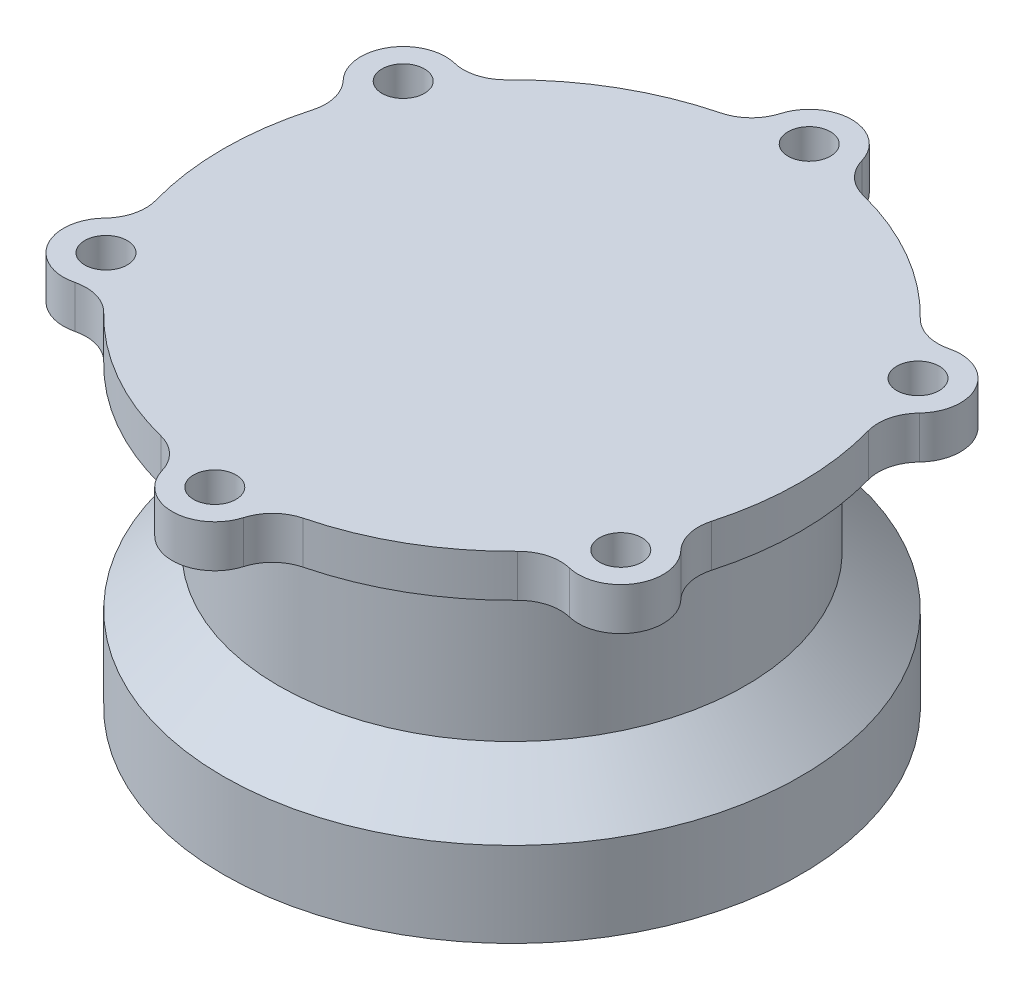
ISO-10303-21;
HEADER;
FILE_DESCRIPTION(('STEP AP214'),'2;1');
FILE_NAME('part.step','',(''),(''),'','','');
FILE_SCHEMA(('AUTOMOTIVE_DESIGN { 1 0 10303 214 1 1 1 1 }'));
ENDSEC;
DATA;
#1=APPLICATION_CONTEXT('core data for automotive mechanical design processes');
#2=APPLICATION_PROTOCOL_DEFINITION('international standard','automotive_design',2000,#1);
#3=PRODUCT_CONTEXT('',#1,'mechanical');
#4=PRODUCT('Part','Part','',(#3));
#5=PRODUCT_RELATED_PRODUCT_CATEGORY('part','',(#4));
#6=PRODUCT_DEFINITION_FORMATION('','',#4);
#7=PRODUCT_DEFINITION_CONTEXT('part definition',#1,'design');
#8=PRODUCT_DEFINITION('design','',#6,#7);
#9=PRODUCT_DEFINITION_SHAPE('','',#8);
#10=(LENGTH_UNIT() NAMED_UNIT(*) SI_UNIT(.MILLI.,.METRE.));
#11=(NAMED_UNIT(*) PLANE_ANGLE_UNIT() SI_UNIT($,.RADIAN.));
#12=(NAMED_UNIT(*) SI_UNIT($,.STERADIAN.) SOLID_ANGLE_UNIT());
#13=UNCERTAINTY_MEASURE_WITH_UNIT(LENGTH_MEASURE(1.E-05),#10,'distance_accuracy_value','');
#14=(GEOMETRIC_REPRESENTATION_CONTEXT(3) GLOBAL_UNCERTAINTY_ASSIGNED_CONTEXT((#13)) GLOBAL_UNIT_ASSIGNED_CONTEXT((#10,
#11,#12)) REPRESENTATION_CONTEXT('',''));
#15=CARTESIAN_POINT('',(0.,0.,0.));
#16=DIRECTION('',(0.,0.,1.));
#17=DIRECTION('',(1.,0.,0.));
#18=AXIS2_PLACEMENT_3D('',#15,#16,#17);
#19=CARTESIAN_POINT('',(0.,0.,0.));
#20=DIRECTION('',(0.,-1.,0.));
#21=DIRECTION('',(0.,0.,-1.));
#22=AXIS2_PLACEMENT_3D('',#19,#20,#21);
#23=PLANE('',#22);
#24=CARTESIAN_POINT('',(0.,0.,0.));
#25=DIRECTION('',(0.,1.,0.));
#26=DIRECTION('',(0.,0.,1.));
#27=AXIS2_PLACEMENT_3D('',#24,#25,#26);
#28=CIRCLE('',#27,34.);
#29=CARTESIAN_POINT('',(0.,0.,34.));
#30=VERTEX_POINT('',#29);
#31=EDGE_CURVE('E299',#30,#30,#28,.T.);
#32=ORIENTED_EDGE('',*,*,#31,.F.);
#33=EDGE_LOOP('',(#32));
#34=FACE_BOUND('',#33,.T.);
#35=ADVANCED_FACE('F33',(#34),#23,.T.);
#36=CARTESIAN_POINT('',(0.,67.2765631047677,0.));
#37=DIRECTION('',(0.,1.,0.));
#38=DIRECTION('',(0.,0.,1.));
#39=AXIS2_PLACEMENT_3D('',#36,#37,#38);
#40=CYLINDRICAL_SURFACE('',#39,34.);
#41=ORIENTED_EDGE('',*,*,#31,.T.);
#42=EDGE_LOOP('',(#41));
#43=FACE_BOUND('',#42,.T.);
#44=CARTESIAN_POINT('',(0.,9.99999999999999,0.));
#45=DIRECTION('',(0.,1.,0.));
#46=DIRECTION('',(0.,0.,1.));
#47=AXIS2_PLACEMENT_3D('',#44,#45,#46);
#48=CIRCLE('',#47,34.);
#49=CARTESIAN_POINT('',(0.,9.99999999999999,34.));
#50=VERTEX_POINT('',#49);
#51=EDGE_CURVE('E296',#50,#50,#48,.T.);
#52=ORIENTED_EDGE('',*,*,#51,.F.);
#53=EDGE_LOOP('',(#52));
#54=FACE_BOUND('',#53,.T.);
#55=ADVANCED_FACE('F467',(#43,#54),#40,.T.);
#56=CARTESIAN_POINT('',(0.,16.,0.));
#57=DIRECTION('',(0.,-1.,0.));
#58=DIRECTION('',(0.,0.,-1.));
#59=AXIS2_PLACEMENT_3D('',#56,#57,#58);
#60=CONICAL_SURFACE('',#59,27.5,0.825376850520739);
#61=ORIENTED_EDGE('',*,*,#51,.T.);
#62=EDGE_LOOP('',(#61));
#63=FACE_BOUND('',#62,.T.);
#64=CARTESIAN_POINT('',(0.,16.,0.));
#65=DIRECTION('',(0.,1.,0.));
#66=DIRECTION('',(0.,0.,1.));
#67=AXIS2_PLACEMENT_3D('',#64,#65,#66);
#68=CIRCLE('',#67,27.5);
#69=CARTESIAN_POINT('',(0.,16.,27.5));
#70=VERTEX_POINT('',#69);
#71=EDGE_CURVE('E292',#70,#70,#68,.T.);
#72=ORIENTED_EDGE('',*,*,#71,.F.);
#73=EDGE_LOOP('',(#72));
#74=FACE_BOUND('',#73,.T.);
#75=ADVANCED_FACE('F473',(#63,#74),#60,.T.);
#76=CARTESIAN_POINT('',(0.,67.2765631047677,0.));
#77=DIRECTION('',(0.,1.,0.));
#78=DIRECTION('',(0.,0.,1.));
#79=AXIS2_PLACEMENT_3D('',#76,#77,#78);
#80=CYLINDRICAL_SURFACE('',#79,27.5);
#81=ORIENTED_EDGE('',*,*,#71,.T.);
#82=EDGE_LOOP('',(#81));
#83=FACE_BOUND('',#82,.T.);
#84=CARTESIAN_POINT('',(0.,35.,0.));
#85=DIRECTION('',(0.,1.,0.));
#86=DIRECTION('',(0.,0.,1.));
#87=AXIS2_PLACEMENT_3D('',#84,#85,#86);
#88=CIRCLE('',#87,27.5);
#89=CARTESIAN_POINT('',(0.,35.,27.5));
#90=VERTEX_POINT('',#89);
#91=EDGE_CURVE('E289',#90,#90,#88,.T.);
#92=ORIENTED_EDGE('',*,*,#91,.F.);
#93=EDGE_LOOP('',(#92));
#94=FACE_BOUND('',#93,.T.);
#95=ADVANCED_FACE('F571',(#83,#94),#80,.T.);
#96=CARTESIAN_POINT('',(0.,40.,35.));
#97=DIRECTION('',(0.,-1.,0.));
#98=DIRECTION('',(0.,0.,-1.));
#99=AXIS2_PLACEMENT_3D('',#96,#97,#98);
#100=CYLINDRICAL_SURFACE('',#99,5.);
#101=CARTESIAN_POINT('',(0.,40.,35.));
#102=DIRECTION('',(0.,1.,0.));
#103=DIRECTION('',(0.,0.,1.));
#104=AXIS2_PLACEMENT_3D('',#101,#102,#103);
#105=CIRCLE('',#104,5.);
#106=CARTESIAN_POINT('',(-4.8,40.,36.4));
#107=VERTEX_POINT('',#106);
#108=CARTESIAN_POINT('',(4.80000000000001,40.,36.4));
#109=VERTEX_POINT('',#108);
#110=EDGE_CURVE('E288',#107,#109,#105,.T.);
#111=ORIENTED_EDGE('',*,*,#110,.F.);
#112=DIRECTION('',(0.,-1.,0.));
#113=VECTOR('',#112,1.);
#114=CARTESIAN_POINT('',(-4.8,40.,36.4));
#115=LINE('',#114,#113);
#116=CARTESIAN_POINT('',(-4.8,35.,36.4));
#117=VERTEX_POINT('',#116);
#118=EDGE_CURVE('E206',#107,#117,#115,.T.);
#119=ORIENTED_EDGE('',*,*,#118,.T.);
#120=CARTESIAN_POINT('',(0.,35.,35.));
#121=DIRECTION('',(0.,1.,0.));
#122=DIRECTION('',(0.,0.,1.));
#123=AXIS2_PLACEMENT_3D('',#120,#121,#122);
#124=CIRCLE('',#123,5.);
#125=CARTESIAN_POINT('',(4.80000000000001,35.,36.4));
#126=VERTEX_POINT('',#125);
#127=EDGE_CURVE('E235',#117,#126,#124,.T.);
#128=ORIENTED_EDGE('',*,*,#127,.T.);
#129=DIRECTION('',(0.,-1.,0.));
#130=VECTOR('',#129,1.);
#131=CARTESIAN_POINT('',(4.80000000000001,40.,36.4));
#132=LINE('',#131,#130);
#133=EDGE_CURVE('E48',#126,#109,#132,.F.);
#134=ORIENTED_EDGE('',*,*,#133,.T.);
#135=EDGE_LOOP('',(#111,#119,#128,#134));
#136=FACE_BOUND('',#135,.T.);
#137=ADVANCED_FACE('F390',(#136),#100,.T.);
#138=CARTESIAN_POINT('',(0.,40.,0.));
#139=DIRECTION('',(0.,-1.,0.));
#140=DIRECTION('',(0.,0.,-1.));
#141=AXIS2_PLACEMENT_3D('',#138,#139,#140);
#142=CYLINDRICAL_SURFACE('',#141,34.);
#143=CARTESIAN_POINT('',(0.,35.,0.));
#144=DIRECTION('',(0.,1.,0.));
#145=DIRECTION('',(0.,0.,1.));
#146=AXIS2_PLACEMENT_3D('',#143,#144,#145);
#147=CIRCLE('',#146,34.);
#148=CARTESIAN_POINT('',(8.36923076923078,35.,32.9538461538462));
#149=VERTEX_POINT('',#148);
#150=CARTESIAN_POINT('',(24.3542525370195,35.,23.7248895332113));
#151=VERTEX_POINT('',#150);
#152=EDGE_CURVE('E225',#149,#151,#147,.T.);
#153=ORIENTED_EDGE('',*,*,#152,.T.);
#154=DIRECTION('',(0.,-1.,0.));
#155=VECTOR('',#154,1.);
#156=CARTESIAN_POINT('',(24.3542525370195,40.,23.7248895332113));
#157=LINE('',#156,#155);
#158=CARTESIAN_POINT('',(24.3542525370195,40.,23.7248895332113));
#159=VERTEX_POINT('',#158);
#160=EDGE_CURVE('E344',#151,#159,#157,.F.);
#161=ORIENTED_EDGE('',*,*,#160,.T.);
#162=CARTESIAN_POINT('',(0.,40.,0.));
#163=DIRECTION('',(0.,1.,0.));
#164=DIRECTION('',(0.,0.,1.));
#165=AXIS2_PLACEMENT_3D('',#162,#163,#164);
#166=CIRCLE('',#165,34.);
#167=CARTESIAN_POINT('',(8.36923076923078,40.,32.9538461538462));
#168=VERTEX_POINT('',#167);
#169=EDGE_CURVE('E397',#168,#159,#166,.T.);
#170=ORIENTED_EDGE('',*,*,#169,.F.);
#171=DIRECTION('',(0.,-1.,0.));
#172=VECTOR('',#171,1.);
#173=CARTESIAN_POINT('',(8.36923076923078,40.,32.9538461538462));
#174=LINE('',#173,#172);
#175=EDGE_CURVE('E341',#168,#149,#174,.T.);
#176=ORIENTED_EDGE('',*,*,#175,.T.);
#177=EDGE_LOOP('',(#153,#161,#170,#176));
#178=FACE_BOUND('',#177,.T.);
#179=ADVANCED_FACE('F400',(#178),#142,.T.);
#180=CARTESIAN_POINT('',(30.3108891324554,40.,17.5));
#181=DIRECTION('',(0.,-1.,0.));
#182=DIRECTION('',(0.,0.,-1.));
#183=AXIS2_PLACEMENT_3D('',#180,#181,#182);
#184=CYLINDRICAL_SURFACE('',#183,5.);
#185=CARTESIAN_POINT('',(30.3108891324554,40.,17.5));
#186=DIRECTION('',(0.,1.,0.));
#187=DIRECTION('',(0.,0.,1.));
#188=AXIS2_PLACEMENT_3D('',#185,#186,#187);
#189=CIRCLE('',#188,5.);
#190=CARTESIAN_POINT('',(29.1233246977536,40.,22.3569219381653));
#191=VERTEX_POINT('',#190);
#192=CARTESIAN_POINT('',(33.9233246977536,40.,14.0430780618347));
#193=VERTEX_POINT('',#192);
#194=EDGE_CURVE('E402',#191,#193,#189,.T.);
#195=ORIENTED_EDGE('',*,*,#194,.F.);
#196=DIRECTION('',(0.,-1.,0.));
#197=VECTOR('',#196,1.);
#198=CARTESIAN_POINT('',(29.1233246977536,40.,22.3569219381653));
#199=LINE('',#198,#197);
#200=CARTESIAN_POINT('',(29.1233246977536,35.,22.3569219381653));
#201=VERTEX_POINT('',#200);
#202=EDGE_CURVE('E339',#191,#201,#199,.T.);
#203=ORIENTED_EDGE('',*,*,#202,.T.);
#204=CARTESIAN_POINT('',(30.3108891324554,35.,17.5));
#205=DIRECTION('',(0.,1.,0.));
#206=DIRECTION('',(0.,0.,1.));
#207=AXIS2_PLACEMENT_3D('',#204,#205,#206);
#208=CIRCLE('',#207,5.);
#209=CARTESIAN_POINT('',(33.9233246977536,35.,14.0430780618347));
#210=VERTEX_POINT('',#209);
#211=EDGE_CURVE('E234',#201,#210,#208,.T.);
#212=ORIENTED_EDGE('',*,*,#211,.T.);
#213=DIRECTION('',(0.,-1.,0.));
#214=VECTOR('',#213,1.);
#215=CARTESIAN_POINT('',(33.9233246977536,40.,14.0430780618347));
#216=LINE('',#215,#214);
#217=EDGE_CURVE('E337',#210,#193,#216,.F.);
#218=ORIENTED_EDGE('',*,*,#217,.T.);
#219=EDGE_LOOP('',(#195,#203,#212,#218));
#220=FACE_BOUND('',#219,.T.);
#221=ADVANCED_FACE('F558',(#220),#184,.T.);
#222=CARTESIAN_POINT('',(32.7234833062503,35.,9.22895662063485));
#223=VERTEX_POINT('',#222);
#224=CARTESIAN_POINT('',(32.7234833062503,35.,-9.22895662063485));
#225=VERTEX_POINT('',#224);
#226=EDGE_CURVE('E236',#223,#225,#147,.T.);
#227=ORIENTED_EDGE('',*,*,#226,.T.);
#228=DIRECTION('',(0.,-1.,0.));
#229=VECTOR('',#228,1.);
#230=CARTESIAN_POINT('',(32.7234833062503,40.,-9.22895662063485));
#231=LINE('',#230,#229);
#232=CARTESIAN_POINT('',(32.7234833062503,40.,-9.22895662063485));
#233=VERTEX_POINT('',#232);
#234=EDGE_CURVE('E335',#225,#233,#231,.F.);
#235=ORIENTED_EDGE('',*,*,#234,.T.);
#236=CARTESIAN_POINT('',(32.7234833062503,40.,9.22895662063485));
#237=VERTEX_POINT('',#236);
#238=EDGE_CURVE('E404',#237,#233,#166,.T.);
#239=ORIENTED_EDGE('',*,*,#238,.F.);
#240=DIRECTION('',(0.,-1.,0.));
#241=VECTOR('',#240,1.);
#242=CARTESIAN_POINT('',(32.7234833062503,40.,9.22895662063485));
#243=LINE('',#242,#241);
#244=EDGE_CURVE('E333',#237,#223,#243,.T.);
#245=ORIENTED_EDGE('',*,*,#244,.T.);
#246=EDGE_LOOP('',(#227,#235,#239,#245));
#247=FACE_BOUND('',#246,.T.);
#248=ADVANCED_FACE('F527',(#247),#142,.T.);
#249=CARTESIAN_POINT('',(30.3108891324554,40.,-17.5));
#250=DIRECTION('',(0.,-1.,0.));
#251=DIRECTION('',(0.,0.,-1.));
#252=AXIS2_PLACEMENT_3D('',#249,#250,#251);
#253=CYLINDRICAL_SURFACE('',#252,5.);
#254=CARTESIAN_POINT('',(30.3108891324554,35.,-17.5));
#255=DIRECTION('',(0.,1.,0.));
#256=DIRECTION('',(0.,0.,1.));
#257=AXIS2_PLACEMENT_3D('',#254,#255,#256);
#258=CIRCLE('',#257,5.);
#259=CARTESIAN_POINT('',(33.9233246977536,35.,-14.0430780618347));
#260=VERTEX_POINT('',#259);
#261=CARTESIAN_POINT('',(29.1233246977536,35.,-22.3569219381653));
#262=VERTEX_POINT('',#261);
#263=EDGE_CURVE('E256',#260,#262,#258,.T.);
#264=ORIENTED_EDGE('',*,*,#263,.T.);
#265=DIRECTION('',(0.,-1.,0.));
#266=VECTOR('',#265,1.);
#267=CARTESIAN_POINT('',(29.1233246977536,40.,-22.3569219381653));
#268=LINE('',#267,#266);
#269=CARTESIAN_POINT('',(29.1233246977536,40.,-22.3569219381653));
#270=VERTEX_POINT('',#269);
#271=EDGE_CURVE('E331',#262,#270,#268,.F.);
#272=ORIENTED_EDGE('',*,*,#271,.T.);
#273=CARTESIAN_POINT('',(30.3108891324554,40.,-17.5));
#274=DIRECTION('',(0.,1.,0.));
#275=DIRECTION('',(0.,0.,1.));
#276=AXIS2_PLACEMENT_3D('',#273,#274,#275);
#277=CIRCLE('',#276,5.);
#278=CARTESIAN_POINT('',(33.9233246977536,40.,-14.0430780618347));
#279=VERTEX_POINT('',#278);
#280=EDGE_CURVE('E409',#279,#270,#277,.T.);
#281=ORIENTED_EDGE('',*,*,#280,.F.);
#282=DIRECTION('',(0.,-1.,0.));
#283=VECTOR('',#282,1.);
#284=CARTESIAN_POINT('',(33.9233246977536,40.,-14.0430780618347));
#285=LINE('',#284,#283);
#286=EDGE_CURVE('E328',#279,#260,#285,.T.);
#287=ORIENTED_EDGE('',*,*,#286,.T.);
#288=EDGE_LOOP('',(#264,#272,#281,#287));
#289=FACE_BOUND('',#288,.T.);
#290=ADVANCED_FACE('F530',(#289),#253,.T.);
#291=CARTESIAN_POINT('',(24.3542525370195,40.,-23.7248895332113));
#292=VERTEX_POINT('',#291);
#293=CARTESIAN_POINT('',(8.36923076923078,40.,-32.9538461538462));
#294=VERTEX_POINT('',#293);
#295=EDGE_CURVE('E410',#292,#294,#166,.T.);
#296=ORIENTED_EDGE('',*,*,#295,.F.);
#297=DIRECTION('',(0.,-1.,0.));
#298=VECTOR('',#297,1.);
#299=CARTESIAN_POINT('',(24.3542525370195,40.,-23.7248895332113));
#300=LINE('',#299,#298);
#301=CARTESIAN_POINT('',(24.3542525370195,35.,-23.7248895332113));
#302=VERTEX_POINT('',#301);
#303=EDGE_CURVE('E326',#292,#302,#300,.T.);
#304=ORIENTED_EDGE('',*,*,#303,.T.);
#305=CARTESIAN_POINT('',(8.36923076923078,35.,-32.9538461538462));
#306=VERTEX_POINT('',#305);
#307=EDGE_CURVE('E248',#302,#306,#147,.T.);
#308=ORIENTED_EDGE('',*,*,#307,.T.);
#309=DIRECTION('',(0.,-1.,0.));
#310=VECTOR('',#309,1.);
#311=CARTESIAN_POINT('',(8.36923076923078,40.,-32.9538461538462));
#312=LINE('',#311,#310);
#313=EDGE_CURVE('E324',#306,#294,#312,.F.);
#314=ORIENTED_EDGE('',*,*,#313,.T.);
#315=EDGE_LOOP('',(#296,#304,#308,#314));
#316=FACE_BOUND('',#315,.T.);
#317=ADVANCED_FACE('F534',(#316),#142,.T.);
#318=CARTESIAN_POINT('',(0.,40.,-35.));
#319=DIRECTION('',(0.,-1.,0.));
#320=DIRECTION('',(0.,0.,-1.));
#321=AXIS2_PLACEMENT_3D('',#318,#319,#320);
#322=CYLINDRICAL_SURFACE('',#321,5.);
#323=CARTESIAN_POINT('',(0.,35.,-35.));
#324=DIRECTION('',(0.,1.,0.));
#325=DIRECTION('',(0.,0.,1.));
#326=AXIS2_PLACEMENT_3D('',#323,#324,#325);
#327=CIRCLE('',#326,5.);
#328=CARTESIAN_POINT('',(4.8,35.,-36.4));
#329=VERTEX_POINT('',#328);
#330=CARTESIAN_POINT('',(-4.8,35.,-36.4));
#331=VERTEX_POINT('',#330);
#332=EDGE_CURVE('E247',#329,#331,#327,.T.);
#333=ORIENTED_EDGE('',*,*,#332,.T.);
#334=DIRECTION('',(0.,-1.,0.));
#335=VECTOR('',#334,1.);
#336=CARTESIAN_POINT('',(-4.8,40.,-36.4));
#337=LINE('',#336,#335);
#338=CARTESIAN_POINT('',(-4.8,40.,-36.4));
#339=VERTEX_POINT('',#338);
#340=EDGE_CURVE('E322',#331,#339,#337,.F.);
#341=ORIENTED_EDGE('',*,*,#340,.T.);
#342=CARTESIAN_POINT('',(0.,40.,-35.));
#343=DIRECTION('',(0.,1.,0.));
#344=DIRECTION('',(0.,0.,1.));
#345=AXIS2_PLACEMENT_3D('',#342,#343,#344);
#346=CIRCLE('',#345,5.);
#347=CARTESIAN_POINT('',(4.8,40.,-36.4));
#348=VERTEX_POINT('',#347);
#349=EDGE_CURVE('E427',#348,#339,#346,.T.);
#350=ORIENTED_EDGE('',*,*,#349,.F.);
#351=DIRECTION('',(0.,-1.,0.));
#352=VECTOR('',#351,1.);
#353=CARTESIAN_POINT('',(4.8,40.,-36.4));
#354=LINE('',#353,#352);
#355=EDGE_CURVE('E319',#348,#329,#354,.T.);
#356=ORIENTED_EDGE('',*,*,#355,.T.);
#357=EDGE_LOOP('',(#333,#341,#350,#356));
#358=FACE_BOUND('',#357,.T.);
#359=ADVANCED_FACE('F539',(#358),#322,.T.);
#360=CARTESIAN_POINT('',(-8.36923076923077,40.,-32.9538461538462));
#361=VERTEX_POINT('',#360);
#362=CARTESIAN_POINT('',(-24.3542525370195,40.,-23.7248895332113));
#363=VERTEX_POINT('',#362);
#364=EDGE_CURVE('E421',#361,#363,#166,.T.);
#365=ORIENTED_EDGE('',*,*,#364,.F.);
#366=DIRECTION('',(0.,-1.,0.));
#367=VECTOR('',#366,1.);
#368=CARTESIAN_POINT('',(-8.36923076923077,40.,-32.9538461538462));
#369=LINE('',#368,#367);
#370=CARTESIAN_POINT('',(-8.36923076923077,35.,-32.9538461538462));
#371=VERTEX_POINT('',#370);
#372=EDGE_CURVE('E317',#361,#371,#369,.T.);
#373=ORIENTED_EDGE('',*,*,#372,.T.);
#374=CARTESIAN_POINT('',(-24.3542525370195,35.,-23.7248895332113));
#375=VERTEX_POINT('',#374);
#376=EDGE_CURVE('E239',#371,#375,#147,.T.);
#377=ORIENTED_EDGE('',*,*,#376,.T.);
#378=DIRECTION('',(0.,-1.,0.));
#379=VECTOR('',#378,1.);
#380=CARTESIAN_POINT('',(-24.3542525370195,40.,-23.7248895332113));
#381=LINE('',#380,#379);
#382=EDGE_CURVE('E315',#375,#363,#381,.F.);
#383=ORIENTED_EDGE('',*,*,#382,.T.);
#384=EDGE_LOOP('',(#365,#373,#377,#383));
#385=FACE_BOUND('',#384,.T.);
#386=ADVANCED_FACE('F543',(#385),#142,.T.);
#387=CARTESIAN_POINT('',(-30.3108891324554,40.,-17.5));
#388=DIRECTION('',(0.,-1.,0.));
#389=DIRECTION('',(0.,0.,-1.));
#390=AXIS2_PLACEMENT_3D('',#387,#388,#389);
#391=CYLINDRICAL_SURFACE('',#390,5.);
#392=CARTESIAN_POINT('',(-30.3108891324554,35.,-17.5));
#393=DIRECTION('',(0.,1.,0.));
#394=DIRECTION('',(0.,0.,1.));
#395=AXIS2_PLACEMENT_3D('',#392,#393,#394);
#396=CIRCLE('',#395,5.);
#397=CARTESIAN_POINT('',(-29.1233246977536,35.,-22.3569219381653));
#398=VERTEX_POINT('',#397);
#399=CARTESIAN_POINT('',(-33.9233246977536,35.,-14.0430780618347));
#400=VERTEX_POINT('',#399);
#401=EDGE_CURVE('E238',#398,#400,#396,.T.);
#402=ORIENTED_EDGE('',*,*,#401,.T.);
#403=DIRECTION('',(0.,-1.,0.));
#404=VECTOR('',#403,1.);
#405=CARTESIAN_POINT('',(-33.9233246977536,40.,-14.0430780618347));
#406=LINE('',#405,#404);
#407=CARTESIAN_POINT('',(-33.9233246977536,40.,-14.0430780618347));
#408=VERTEX_POINT('',#407);
#409=EDGE_CURVE('E313',#400,#408,#406,.F.);
#410=ORIENTED_EDGE('',*,*,#409,.T.);
#411=CARTESIAN_POINT('',(-30.3108891324554,40.,-17.5));
#412=DIRECTION('',(0.,1.,0.));
#413=DIRECTION('',(0.,0.,1.));
#414=AXIS2_PLACEMENT_3D('',#411,#412,#413);
#415=CIRCLE('',#414,5.);
#416=CARTESIAN_POINT('',(-29.1233246977536,40.,-22.3569219381653));
#417=VERTEX_POINT('',#416);
#418=EDGE_CURVE('E420',#417,#408,#415,.T.);
#419=ORIENTED_EDGE('',*,*,#418,.F.);
#420=DIRECTION('',(0.,-1.,0.));
#421=VECTOR('',#420,1.);
#422=CARTESIAN_POINT('',(-29.1233246977536,40.,-22.3569219381653));
#423=LINE('',#422,#421);
#424=EDGE_CURVE('E310',#417,#398,#423,.T.);
#425=ORIENTED_EDGE('',*,*,#424,.T.);
#426=EDGE_LOOP('',(#402,#410,#419,#425));
#427=FACE_BOUND('',#426,.T.);
#428=ADVANCED_FACE('F548',(#427),#391,.T.);
#429=CARTESIAN_POINT('',(-32.7234833062503,40.,-9.22895662063484));
#430=VERTEX_POINT('',#429);
#431=CARTESIAN_POINT('',(-32.7234833062503,40.,9.22895662063486));
#432=VERTEX_POINT('',#431);
#433=EDGE_CURVE('E413',#430,#432,#166,.T.);
#434=ORIENTED_EDGE('',*,*,#433,.F.);
#435=DIRECTION('',(0.,-1.,0.));
#436=VECTOR('',#435,1.);
#437=CARTESIAN_POINT('',(-32.7234833062503,40.,-9.22895662063484));
#438=LINE('',#437,#436);
#439=CARTESIAN_POINT('',(-32.7234833062503,35.,-9.22895662063484));
#440=VERTEX_POINT('',#439);
#441=EDGE_CURVE('E308',#430,#440,#438,.T.);
#442=ORIENTED_EDGE('',*,*,#441,.T.);
#443=CARTESIAN_POINT('',(-32.7234833062503,35.,9.22895662063486));
#444=VERTEX_POINT('',#443);
#445=EDGE_CURVE('E226',#440,#444,#147,.T.);
#446=ORIENTED_EDGE('',*,*,#445,.T.);
#447=DIRECTION('',(0.,-1.,0.));
#448=VECTOR('',#447,1.);
#449=CARTESIAN_POINT('',(-32.7234833062503,40.,9.22895662063486));
#450=LINE('',#449,#448);
#451=EDGE_CURVE('E306',#444,#432,#450,.F.);
#452=ORIENTED_EDGE('',*,*,#451,.T.);
#453=EDGE_LOOP('',(#434,#442,#446,#452));
#454=FACE_BOUND('',#453,.T.);
#455=ADVANCED_FACE('F552',(#454),#142,.T.);
#456=CARTESIAN_POINT('',(-30.3108891324554,40.,17.5));
#457=DIRECTION('',(0.,-1.,0.));
#458=DIRECTION('',(0.,0.,-1.));
#459=AXIS2_PLACEMENT_3D('',#456,#457,#458);
#460=CYLINDRICAL_SURFACE('',#459,5.);
#461=CARTESIAN_POINT('',(-30.3108891324554,35.,17.5));
#462=DIRECTION('',(0.,1.,0.));
#463=DIRECTION('',(0.,0.,1.));
#464=AXIS2_PLACEMENT_3D('',#461,#462,#463);
#465=CIRCLE('',#464,5.);
#466=CARTESIAN_POINT('',(-33.9233246977536,35.,14.0430780618347));
#467=VERTEX_POINT('',#466);
#468=CARTESIAN_POINT('',(-29.1233246977536,35.,22.3569219381653));
#469=VERTEX_POINT('',#468);
#470=EDGE_CURVE('E223',#467,#469,#465,.T.);
#471=ORIENTED_EDGE('',*,*,#470,.T.);
#472=DIRECTION('',(0.,-1.,0.));
#473=VECTOR('',#472,1.);
#474=CARTESIAN_POINT('',(-29.1233246977536,40.,22.3569219381653));
#475=LINE('',#474,#473);
#476=CARTESIAN_POINT('',(-29.1233246977536,40.,22.3569219381653));
#477=VERTEX_POINT('',#476);
#478=EDGE_CURVE('E200',#469,#477,#475,.F.);
#479=ORIENTED_EDGE('',*,*,#478,.T.);
#480=CARTESIAN_POINT('',(-30.3108891324554,40.,17.5));
#481=DIRECTION('',(0.,1.,0.));
#482=DIRECTION('',(0.,0.,1.));
#483=AXIS2_PLACEMENT_3D('',#480,#481,#482);
#484=CIRCLE('',#483,5.);
#485=CARTESIAN_POINT('',(-33.9233246977536,40.,14.0430780618347));
#486=VERTEX_POINT('',#485);
#487=EDGE_CURVE('E412',#486,#477,#484,.T.);
#488=ORIENTED_EDGE('',*,*,#487,.F.);
#489=DIRECTION('',(0.,-1.,0.));
#490=VECTOR('',#489,1.);
#491=CARTESIAN_POINT('',(-33.9233246977536,40.,14.0430780618347));
#492=LINE('',#491,#490);
#493=EDGE_CURVE('E215',#486,#467,#492,.T.);
#494=ORIENTED_EDGE('',*,*,#493,.T.);
#495=EDGE_LOOP('',(#471,#479,#488,#494));
#496=FACE_BOUND('',#495,.T.);
#497=ADVANCED_FACE('F556',(#496),#460,.T.);
#498=CARTESIAN_POINT('',(-30.3108891324554,40.,17.5));
#499=DIRECTION('',(0.,-1.,0.));
#500=DIRECTION('',(0.,0.,-1.));
#501=AXIS2_PLACEMENT_3D('',#498,#499,#500);
#502=CYLINDRICAL_SURFACE('',#501,2.50000000000032);
#503=CARTESIAN_POINT('',(-30.3108891324554,40.,17.5));
#504=DIRECTION('',(0.,1.,0.));
#505=DIRECTION('',(0.,0.,1.));
#506=AXIS2_PLACEMENT_3D('',#503,#504,#505);
#507=CIRCLE('',#506,2.50000000000032);
#508=CARTESIAN_POINT('',(-30.3108891324554,40.,20.0000000000003));
#509=VERTEX_POINT('',#508);
#510=EDGE_CURVE('E448',#509,#509,#507,.T.);
#511=ORIENTED_EDGE('',*,*,#510,.T.);
#512=EDGE_LOOP('',(#511));
#513=FACE_BOUND('',#512,.T.);
#514=CARTESIAN_POINT('',(-30.3108891324554,35.,17.5));
#515=DIRECTION('',(0.,1.,0.));
#516=DIRECTION('',(0.,0.,1.));
#517=AXIS2_PLACEMENT_3D('',#514,#515,#516);
#518=CIRCLE('',#517,2.50000000000032);
#519=CARTESIAN_POINT('',(-30.3108891324554,35.,20.0000000000003));
#520=VERTEX_POINT('',#519);
#521=EDGE_CURVE('E282',#520,#520,#518,.T.);
#522=ORIENTED_EDGE('',*,*,#521,.F.);
#523=EDGE_LOOP('',(#522));
#524=FACE_BOUND('',#523,.T.);
#525=ADVANCED_FACE('F662',(#513,#524),#502,.F.);
#526=CARTESIAN_POINT('',(-30.3108891324554,40.,-17.5));
#527=DIRECTION('',(0.,-1.,0.));
#528=DIRECTION('',(0.,0.,-1.));
#529=AXIS2_PLACEMENT_3D('',#526,#527,#528);
#530=CYLINDRICAL_SURFACE('',#529,2.50000000000041);
#531=CARTESIAN_POINT('',(-30.3108891324554,40.,-17.5));
#532=DIRECTION('',(0.,1.,0.));
#533=DIRECTION('',(0.,0.,1.));
#534=AXIS2_PLACEMENT_3D('',#531,#532,#533);
#535=CIRCLE('',#534,2.50000000000041);
#536=CARTESIAN_POINT('',(-30.3108891324554,40.,-14.9999999999996));
#537=VERTEX_POINT('',#536);
#538=EDGE_CURVE('E445',#537,#537,#535,.T.);
#539=ORIENTED_EDGE('',*,*,#538,.T.);
#540=EDGE_LOOP('',(#539));
#541=FACE_BOUND('',#540,.T.);
#542=CARTESIAN_POINT('',(-30.3108891324554,35.,-17.5));
#543=DIRECTION('',(0.,1.,0.));
#544=DIRECTION('',(0.,0.,1.));
#545=AXIS2_PLACEMENT_3D('',#542,#543,#544);
#546=CIRCLE('',#545,2.50000000000041);
#547=CARTESIAN_POINT('',(-30.3108891324554,35.,-14.9999999999996));
#548=VERTEX_POINT('',#547);
#549=EDGE_CURVE('E279',#548,#548,#546,.T.);
#550=ORIENTED_EDGE('',*,*,#549,.F.);
#551=EDGE_LOOP('',(#550));
#552=FACE_BOUND('',#551,.T.);
#553=ADVANCED_FACE('F930',(#541,#552),#530,.F.);
#554=CARTESIAN_POINT('',(0.,40.,-35.));
#555=DIRECTION('',(0.,-1.,0.));
#556=DIRECTION('',(0.,0.,-1.));
#557=AXIS2_PLACEMENT_3D('',#554,#555,#556);
#558=CYLINDRICAL_SURFACE('',#557,2.5);
#559=CARTESIAN_POINT('',(0.,40.,-35.));
#560=DIRECTION('',(0.,1.,0.));
#561=DIRECTION('',(0.,0.,1.));
#562=AXIS2_PLACEMENT_3D('',#559,#560,#561);
#563=CIRCLE('',#562,2.5);
#564=CARTESIAN_POINT('',(0.,40.,-32.5));
#565=VERTEX_POINT('',#564);
#566=EDGE_CURVE('E442',#565,#565,#563,.T.);
#567=ORIENTED_EDGE('',*,*,#566,.T.);
#568=EDGE_LOOP('',(#567));
#569=FACE_BOUND('',#568,.T.);
#570=CARTESIAN_POINT('',(0.,35.,-35.));
#571=DIRECTION('',(0.,1.,0.));
#572=DIRECTION('',(0.,0.,1.));
#573=AXIS2_PLACEMENT_3D('',#570,#571,#572);
#574=CIRCLE('',#573,2.5);
#575=CARTESIAN_POINT('',(0.,35.,-32.5));
#576=VERTEX_POINT('',#575);
#577=EDGE_CURVE('E276',#576,#576,#574,.T.);
#578=ORIENTED_EDGE('',*,*,#577,.F.);
#579=EDGE_LOOP('',(#578));
#580=FACE_BOUND('',#579,.T.);
#581=ADVANCED_FACE('F920',(#569,#580),#558,.F.);
#582=CARTESIAN_POINT('',(30.3108891324554,40.,-17.5));
#583=DIRECTION('',(0.,-1.,0.));
#584=DIRECTION('',(0.,0.,-1.));
#585=AXIS2_PLACEMENT_3D('',#582,#583,#584);
#586=CYLINDRICAL_SURFACE('',#585,2.50000000000007);
#587=CARTESIAN_POINT('',(30.3108891324554,40.,-17.5));
#588=DIRECTION('',(0.,1.,0.));
#589=DIRECTION('',(0.,0.,1.));
#590=AXIS2_PLACEMENT_3D('',#587,#588,#589);
#591=CIRCLE('',#590,2.50000000000007);
#592=CARTESIAN_POINT('',(30.3108891324554,40.,-14.9999999999999));
#593=VERTEX_POINT('',#592);
#594=EDGE_CURVE('E415',#593,#593,#591,.T.);
#595=ORIENTED_EDGE('',*,*,#594,.T.);
#596=EDGE_LOOP('',(#595));
#597=FACE_BOUND('',#596,.T.);
#598=CARTESIAN_POINT('',(30.3108891324554,35.,-17.5));
#599=DIRECTION('',(0.,1.,0.));
#600=DIRECTION('',(0.,0.,1.));
#601=AXIS2_PLACEMENT_3D('',#598,#599,#600);
#602=CIRCLE('',#601,2.50000000000007);
#603=CARTESIAN_POINT('',(30.3108891324554,35.,-14.9999999999999));
#604=VERTEX_POINT('',#603);
#605=EDGE_CURVE('E228',#604,#604,#602,.T.);
#606=ORIENTED_EDGE('',*,*,#605,.F.);
#607=EDGE_LOOP('',(#606));
#608=FACE_BOUND('',#607,.T.);
#609=ADVANCED_FACE('F910',(#597,#608),#586,.F.);
#610=CARTESIAN_POINT('',(30.3108891324554,40.,17.5));
#611=DIRECTION('',(0.,-1.,0.));
#612=DIRECTION('',(0.,0.,-1.));
#613=AXIS2_PLACEMENT_3D('',#610,#611,#612);
#614=CYLINDRICAL_SURFACE('',#613,2.50000000000017);
#615=CARTESIAN_POINT('',(30.3108891324554,40.,17.5));
#616=DIRECTION('',(0.,1.,0.));
#617=DIRECTION('',(0.,0.,1.));
#618=AXIS2_PLACEMENT_3D('',#615,#616,#617);
#619=CIRCLE('',#618,2.50000000000017);
#620=CARTESIAN_POINT('',(30.3108891324554,40.,20.0000000000002));
#621=VERTEX_POINT('',#620);
#622=EDGE_CURVE('E411',#621,#621,#619,.T.);
#623=ORIENTED_EDGE('',*,*,#622,.T.);
#624=EDGE_LOOP('',(#623));
#625=FACE_BOUND('',#624,.T.);
#626=CARTESIAN_POINT('',(30.3108891324554,35.,17.5));
#627=DIRECTION('',(0.,1.,0.));
#628=DIRECTION('',(0.,0.,1.));
#629=AXIS2_PLACEMENT_3D('',#626,#627,#628);
#630=CIRCLE('',#629,2.50000000000017);
#631=CARTESIAN_POINT('',(30.3108891324554,35.,20.0000000000002));
#632=VERTEX_POINT('',#631);
#633=EDGE_CURVE('E222',#632,#632,#630,.T.);
#634=ORIENTED_EDGE('',*,*,#633,.F.);
#635=EDGE_LOOP('',(#634));
#636=FACE_BOUND('',#635,.T.);
#637=ADVANCED_FACE('F672',(#625,#636),#614,.F.);
#638=CARTESIAN_POINT('',(-24.3542525370195,40.,23.7248895332113));
#639=VERTEX_POINT('',#638);
#640=CARTESIAN_POINT('',(-8.36923076923077,40.,32.9538461538462));
#641=VERTEX_POINT('',#640);
#642=EDGE_CURVE('E214',#639,#641,#166,.T.);
#643=ORIENTED_EDGE('',*,*,#642,.F.);
#644=DIRECTION('',(0.,-1.,0.));
#645=VECTOR('',#644,1.);
#646=CARTESIAN_POINT('',(-24.3542525370195,40.,23.7248895332113));
#647=LINE('',#646,#645);
#648=CARTESIAN_POINT('',(-24.3542525370195,35.,23.7248895332113));
#649=VERTEX_POINT('',#648);
#650=EDGE_CURVE('E199',#639,#649,#647,.T.);
#651=ORIENTED_EDGE('',*,*,#650,.T.);
#652=CARTESIAN_POINT('',(-8.36923076923077,35.,32.9538461538462));
#653=VERTEX_POINT('',#652);
#654=EDGE_CURVE('E212',#649,#653,#147,.T.);
#655=ORIENTED_EDGE('',*,*,#654,.T.);
#656=DIRECTION('',(0.,-1.,0.));
#657=VECTOR('',#656,1.);
#658=CARTESIAN_POINT('',(-8.36923076923077,40.,32.9538461538462));
#659=LINE('',#658,#657);
#660=EDGE_CURVE('E216',#653,#641,#659,.F.);
#661=ORIENTED_EDGE('',*,*,#660,.T.);
#662=EDGE_LOOP('',(#643,#651,#655,#661));
#663=FACE_BOUND('',#662,.T.);
#664=ADVANCED_FACE('F211',(#663),#142,.T.);
#665=CARTESIAN_POINT('',(0.,40.,35.));
#666=DIRECTION('',(0.,-1.,0.));
#667=DIRECTION('',(0.,0.,-1.));
#668=AXIS2_PLACEMENT_3D('',#665,#666,#667);
#669=CYLINDRICAL_SURFACE('',#668,2.50000000000024);
#670=CARTESIAN_POINT('',(0.,40.,35.));
#671=DIRECTION('',(0.,1.,0.));
#672=DIRECTION('',(0.,0.,1.));
#673=AXIS2_PLACEMENT_3D('',#670,#671,#672);
#674=CIRCLE('',#673,2.50000000000024);
#675=CARTESIAN_POINT('',(0.,40.,37.5000000000002));
#676=VERTEX_POINT('',#675);
#677=EDGE_CURVE('E293',#676,#676,#674,.T.);
#678=ORIENTED_EDGE('',*,*,#677,.T.);
#679=EDGE_LOOP('',(#678));
#680=FACE_BOUND('',#679,.T.);
#681=CARTESIAN_POINT('',(0.,35.,35.));
#682=DIRECTION('',(0.,1.,0.));
#683=DIRECTION('',(0.,0.,1.));
#684=AXIS2_PLACEMENT_3D('',#681,#682,#683);
#685=CIRCLE('',#684,2.50000000000024);
#686=CARTESIAN_POINT('',(0.,35.,37.5000000000002));
#687=VERTEX_POINT('',#686);
#688=EDGE_CURVE('E285',#687,#687,#685,.T.);
#689=ORIENTED_EDGE('',*,*,#688,.F.);
#690=EDGE_LOOP('',(#689));
#691=FACE_BOUND('',#690,.T.);
#692=ADVANCED_FACE('F454',(#680,#691),#669,.F.);
#693=CARTESIAN_POINT('',(0.,40.,0.));
#694=DIRECTION('',(0.,1.,0.));
#695=DIRECTION('',(0.,0.,1.));
#696=AXIS2_PLACEMENT_3D('',#693,#694,#695);
#697=PLANE('',#696);
#698=ORIENTED_EDGE('',*,*,#642,.T.);
#699=CARTESIAN_POINT('',(-9.6,40.,37.8));
#700=DIRECTION('',(0.,1.,0.));
#701=DIRECTION('',(0.,0.,1.));
#702=AXIS2_PLACEMENT_3D('',#699,#700,#701);
#703=CIRCLE('',#702,5.);
#704=EDGE_CURVE('E55',#641,#107,#703,.F.);
#705=ORIENTED_EDGE('',*,*,#704,.T.);
#706=ORIENTED_EDGE('',*,*,#110,.T.);
#707=CARTESIAN_POINT('',(9.6,40.,37.8));
#708=DIRECTION('',(0.,1.,0.));
#709=DIRECTION('',(0.,0.,1.));
#710=AXIS2_PLACEMENT_3D('',#707,#708,#709);
#711=CIRCLE('',#710,5.);
#712=EDGE_CURVE('E11',#109,#168,#711,.F.);
#713=ORIENTED_EDGE('',*,*,#712,.T.);
#714=ORIENTED_EDGE('',*,*,#169,.T.);
#715=CARTESIAN_POINT('',(27.9357602630518,40.,27.2138438763306));
#716=DIRECTION('',(0.,1.,0.));
#717=DIRECTION('',(0.,0.,1.));
#718=AXIS2_PLACEMENT_3D('',#715,#716,#717);
#719=CIRCLE('',#718,5.);
#720=EDGE_CURVE('E380',#159,#191,#719,.F.);
#721=ORIENTED_EDGE('',*,*,#720,.T.);
#722=ORIENTED_EDGE('',*,*,#194,.T.);
#723=CARTESIAN_POINT('',(37.5357602630518,40.,10.5861561236694));
#724=DIRECTION('',(0.,1.,0.));
#725=DIRECTION('',(0.,0.,1.));
#726=AXIS2_PLACEMENT_3D('',#723,#724,#725);
#727=CIRCLE('',#726,5.);
#728=EDGE_CURVE('E386',#193,#237,#727,.F.);
#729=ORIENTED_EDGE('',*,*,#728,.T.);
#730=ORIENTED_EDGE('',*,*,#238,.T.);
#731=CARTESIAN_POINT('',(37.5357602630518,40.,-10.5861561236694));
#732=DIRECTION('',(0.,1.,0.));
#733=DIRECTION('',(0.,0.,1.));
#734=AXIS2_PLACEMENT_3D('',#731,#732,#733);
#735=CIRCLE('',#734,5.);
#736=EDGE_CURVE('E376',#233,#279,#735,.F.);
#737=ORIENTED_EDGE('',*,*,#736,.T.);
#738=ORIENTED_EDGE('',*,*,#280,.T.);
#739=CARTESIAN_POINT('',(27.9357602630518,40.,-27.2138438763306));
#740=DIRECTION('',(0.,1.,0.));
#741=DIRECTION('',(0.,0.,1.));
#742=AXIS2_PLACEMENT_3D('',#739,#740,#741);
#743=CIRCLE('',#742,5.);
#744=EDGE_CURVE('E368',#270,#292,#743,.F.);
#745=ORIENTED_EDGE('',*,*,#744,.T.);
#746=ORIENTED_EDGE('',*,*,#295,.T.);
#747=CARTESIAN_POINT('',(9.6,40.,-37.8));
#748=DIRECTION('',(0.,1.,0.));
#749=DIRECTION('',(0.,0.,1.));
#750=AXIS2_PLACEMENT_3D('',#747,#748,#749);
#751=CIRCLE('',#750,5.);
#752=EDGE_CURVE('E372',#294,#348,#751,.F.);
#753=ORIENTED_EDGE('',*,*,#752,.T.);
#754=ORIENTED_EDGE('',*,*,#349,.T.);
#755=CARTESIAN_POINT('',(-9.6,40.,-37.8));
#756=DIRECTION('',(0.,1.,0.));
#757=DIRECTION('',(0.,0.,1.));
#758=AXIS2_PLACEMENT_3D('',#755,#756,#757);
#759=CIRCLE('',#758,5.);
#760=EDGE_CURVE('E360',#339,#361,#759,.F.);
#761=ORIENTED_EDGE('',*,*,#760,.T.);
#762=ORIENTED_EDGE('',*,*,#364,.T.);
#763=CARTESIAN_POINT('',(-27.9357602630518,40.,-27.2138438763306));
#764=DIRECTION('',(0.,1.,0.));
#765=DIRECTION('',(0.,0.,1.));
#766=AXIS2_PLACEMENT_3D('',#763,#764,#765);
#767=CIRCLE('',#766,5.);
#768=EDGE_CURVE('E364',#363,#417,#767,.F.);
#769=ORIENTED_EDGE('',*,*,#768,.T.);
#770=ORIENTED_EDGE('',*,*,#418,.T.);
#771=CARTESIAN_POINT('',(-37.5357602630518,40.,-10.5861561236694));
#772=DIRECTION('',(0.,1.,0.));
#773=DIRECTION('',(0.,0.,1.));
#774=AXIS2_PLACEMENT_3D('',#771,#772,#773);
#775=CIRCLE('',#774,5.);
#776=EDGE_CURVE('E352',#408,#430,#775,.F.);
#777=ORIENTED_EDGE('',*,*,#776,.T.);
#778=ORIENTED_EDGE('',*,*,#433,.T.);
#779=CARTESIAN_POINT('',(-37.5357602630518,40.,10.5861561236694));
#780=DIRECTION('',(0.,1.,0.));
#781=DIRECTION('',(0.,0.,1.));
#782=AXIS2_PLACEMENT_3D('',#779,#780,#781);
#783=CIRCLE('',#782,5.);
#784=EDGE_CURVE('E356',#432,#486,#783,.F.);
#785=ORIENTED_EDGE('',*,*,#784,.T.);
#786=ORIENTED_EDGE('',*,*,#487,.T.);
#787=CARTESIAN_POINT('',(-27.9357602630518,40.,27.2138438763306));
#788=DIRECTION('',(0.,1.,0.));
#789=DIRECTION('',(0.,0.,1.));
#790=AXIS2_PLACEMENT_3D('',#787,#788,#789);
#791=CIRCLE('',#790,5.);
#792=EDGE_CURVE('E205',#477,#639,#791,.F.);
#793=ORIENTED_EDGE('',*,*,#792,.T.);
#794=EDGE_LOOP('',(#698,#705,#706,#713,#714,#721,#722,#729,#730,#737,#738,#745,#746,#753,#754,
#761,#762,#769,#770,#777,#778,#785,#786,#793));
#795=FACE_BOUND('',#794,.T.);
#796=ORIENTED_EDGE('',*,*,#622,.F.);
#797=EDGE_LOOP('',(#796));
#798=FACE_BOUND('',#797,.T.);
#799=ORIENTED_EDGE('',*,*,#594,.F.);
#800=EDGE_LOOP('',(#799));
#801=FACE_BOUND('',#800,.T.);
#802=ORIENTED_EDGE('',*,*,#566,.F.);
#803=EDGE_LOOP('',(#802));
#804=FACE_BOUND('',#803,.T.);
#805=ORIENTED_EDGE('',*,*,#538,.F.);
#806=EDGE_LOOP('',(#805));
#807=FACE_BOUND('',#806,.T.);
#808=ORIENTED_EDGE('',*,*,#510,.F.);
#809=EDGE_LOOP('',(#808));
#810=FACE_BOUND('',#809,.T.);
#811=ORIENTED_EDGE('',*,*,#677,.F.);
#812=EDGE_LOOP('',(#811));
#813=FACE_BOUND('',#812,.T.);
#814=ADVANCED_FACE('F395',(#795,#798,#801,#804,#807,#810,#813),#697,.T.);
#815=CARTESIAN_POINT('',(0.,35.,0.));
#816=DIRECTION('',(0.,1.,0.));
#817=DIRECTION('',(0.,0.,1.));
#818=AXIS2_PLACEMENT_3D('',#815,#816,#817);
#819=PLANE('',#818);
#820=ORIENTED_EDGE('',*,*,#91,.T.);
#821=EDGE_LOOP('',(#820));
#822=FACE_BOUND('',#821,.T.);
#823=ORIENTED_EDGE('',*,*,#127,.F.);
#824=CARTESIAN_POINT('',(-9.6,35.,37.8));
#825=DIRECTION('',(0.,1.,0.));
#826=DIRECTION('',(0.,0.,1.));
#827=AXIS2_PLACEMENT_3D('',#824,#825,#826);
#828=CIRCLE('',#827,5.);
#829=EDGE_CURVE('E221',#117,#653,#828,.T.);
#830=ORIENTED_EDGE('',*,*,#829,.T.);
#831=ORIENTED_EDGE('',*,*,#654,.F.);
#832=CARTESIAN_POINT('',(-27.9357602630518,35.,27.2138438763306));
#833=DIRECTION('',(0.,1.,0.));
#834=DIRECTION('',(0.,0.,1.));
#835=AXIS2_PLACEMENT_3D('',#832,#833,#834);
#836=CIRCLE('',#835,5.);
#837=EDGE_CURVE('E195',#649,#469,#836,.T.);
#838=ORIENTED_EDGE('',*,*,#837,.T.);
#839=ORIENTED_EDGE('',*,*,#470,.F.);
#840=CARTESIAN_POINT('',(-37.5357602630518,35.,10.5861561236694));
#841=DIRECTION('',(0.,1.,0.));
#842=DIRECTION('',(0.,0.,1.));
#843=AXIS2_PLACEMENT_3D('',#840,#841,#842);
#844=CIRCLE('',#843,5.);
#845=EDGE_CURVE('E354',#467,#444,#844,.T.);
#846=ORIENTED_EDGE('',*,*,#845,.T.);
#847=ORIENTED_EDGE('',*,*,#445,.F.);
#848=CARTESIAN_POINT('',(-37.5357602630518,35.,-10.5861561236694));
#849=DIRECTION('',(0.,1.,0.));
#850=DIRECTION('',(0.,0.,1.));
#851=AXIS2_PLACEMENT_3D('',#848,#849,#850);
#852=CIRCLE('',#851,5.);
#853=EDGE_CURVE('E350',#440,#400,#852,.T.);
#854=ORIENTED_EDGE('',*,*,#853,.T.);
#855=ORIENTED_EDGE('',*,*,#401,.F.);
#856=CARTESIAN_POINT('',(-27.9357602630518,35.,-27.2138438763306));
#857=DIRECTION('',(0.,1.,0.));
#858=DIRECTION('',(0.,0.,1.));
#859=AXIS2_PLACEMENT_3D('',#856,#857,#858);
#860=CIRCLE('',#859,5.);
#861=EDGE_CURVE('E362',#398,#375,#860,.T.);
#862=ORIENTED_EDGE('',*,*,#861,.T.);
#863=ORIENTED_EDGE('',*,*,#376,.F.);
#864=CARTESIAN_POINT('',(-9.6,35.,-37.8));
#865=DIRECTION('',(0.,1.,0.));
#866=DIRECTION('',(0.,0.,1.));
#867=AXIS2_PLACEMENT_3D('',#864,#865,#866);
#868=CIRCLE('',#867,5.);
#869=EDGE_CURVE('E358',#371,#331,#868,.T.);
#870=ORIENTED_EDGE('',*,*,#869,.T.);
#871=ORIENTED_EDGE('',*,*,#332,.F.);
#872=CARTESIAN_POINT('',(9.6,35.,-37.8));
#873=DIRECTION('',(0.,1.,0.));
#874=DIRECTION('',(0.,0.,1.));
#875=AXIS2_PLACEMENT_3D('',#872,#873,#874);
#876=CIRCLE('',#875,5.);
#877=EDGE_CURVE('E370',#329,#306,#876,.T.);
#878=ORIENTED_EDGE('',*,*,#877,.T.);
#879=ORIENTED_EDGE('',*,*,#307,.F.);
#880=CARTESIAN_POINT('',(27.9357602630518,35.,-27.2138438763306));
#881=DIRECTION('',(0.,1.,0.));
#882=DIRECTION('',(0.,0.,1.));
#883=AXIS2_PLACEMENT_3D('',#880,#881,#882);
#884=CIRCLE('',#883,5.);
#885=EDGE_CURVE('E366',#302,#262,#884,.T.);
#886=ORIENTED_EDGE('',*,*,#885,.T.);
#887=ORIENTED_EDGE('',*,*,#263,.F.);
#888=CARTESIAN_POINT('',(37.5357602630518,35.,-10.5861561236694));
#889=DIRECTION('',(0.,1.,0.));
#890=DIRECTION('',(0.,0.,1.));
#891=AXIS2_PLACEMENT_3D('',#888,#889,#890);
#892=CIRCLE('',#891,5.);
#893=EDGE_CURVE('E374',#260,#225,#892,.T.);
#894=ORIENTED_EDGE('',*,*,#893,.T.);
#895=ORIENTED_EDGE('',*,*,#226,.F.);
#896=CARTESIAN_POINT('',(37.5357602630518,35.,10.5861561236694));
#897=DIRECTION('',(0.,1.,0.));
#898=DIRECTION('',(0.,0.,1.));
#899=AXIS2_PLACEMENT_3D('',#896,#897,#898);
#900=CIRCLE('',#899,5.);
#901=EDGE_CURVE('E384',#223,#210,#900,.T.);
#902=ORIENTED_EDGE('',*,*,#901,.T.);
#903=ORIENTED_EDGE('',*,*,#211,.F.);
#904=CARTESIAN_POINT('',(27.9357602630518,35.,27.2138438763306));
#905=DIRECTION('',(0.,1.,0.));
#906=DIRECTION('',(0.,0.,1.));
#907=AXIS2_PLACEMENT_3D('',#904,#905,#906);
#908=CIRCLE('',#907,5.);
#909=EDGE_CURVE('E378',#201,#151,#908,.T.);
#910=ORIENTED_EDGE('',*,*,#909,.T.);
#911=ORIENTED_EDGE('',*,*,#152,.F.);
#912=CARTESIAN_POINT('',(9.6,35.,37.8));
#913=DIRECTION('',(0.,1.,0.));
#914=DIRECTION('',(0.,0.,1.));
#915=AXIS2_PLACEMENT_3D('',#912,#913,#914);
#916=CIRCLE('',#915,5.);
#917=EDGE_CURVE('E41',#149,#126,#916,.T.);
#918=ORIENTED_EDGE('',*,*,#917,.T.);
#919=EDGE_LOOP('',(#823,#830,#831,#838,#839,#846,#847,#854,#855,#862,#863,#870,#871,#878,#879,
#886,#887,#894,#895,#902,#903,#910,#911,#918));
#920=FACE_BOUND('',#919,.T.);
#921=ORIENTED_EDGE('',*,*,#633,.T.);
#922=EDGE_LOOP('',(#921));
#923=FACE_BOUND('',#922,.T.);
#924=ORIENTED_EDGE('',*,*,#605,.T.);
#925=EDGE_LOOP('',(#924));
#926=FACE_BOUND('',#925,.T.);
#927=ORIENTED_EDGE('',*,*,#577,.T.);
#928=EDGE_LOOP('',(#927));
#929=FACE_BOUND('',#928,.T.);
#930=ORIENTED_EDGE('',*,*,#549,.T.);
#931=EDGE_LOOP('',(#930));
#932=FACE_BOUND('',#931,.T.);
#933=ORIENTED_EDGE('',*,*,#521,.T.);
#934=EDGE_LOOP('',(#933));
#935=FACE_BOUND('',#934,.T.);
#936=ORIENTED_EDGE('',*,*,#688,.T.);
#937=EDGE_LOOP('',(#936));
#938=FACE_BOUND('',#937,.T.);
#939=ADVANCED_FACE('F219',(#822,#920,#923,#926,#929,#932,#935,#938),#819,.F.);
#940=CARTESIAN_POINT('',(-27.9357602630518,40.,27.2138438763306));
#941=DIRECTION('',(0.,1.,0.));
#942=DIRECTION('',(0.,0.,1.));
#943=AXIS2_PLACEMENT_3D('',#940,#941,#942);
#944=CYLINDRICAL_SURFACE('',#943,5.);
#945=ORIENTED_EDGE('',*,*,#792,.F.);
#946=ORIENTED_EDGE('',*,*,#478,.F.);
#947=ORIENTED_EDGE('',*,*,#837,.F.);
#948=ORIENTED_EDGE('',*,*,#650,.F.);
#949=EDGE_LOOP('',(#945,#946,#947,#948));
#950=FACE_BOUND('',#949,.T.);
#951=ADVANCED_FACE('F198',(#950),#944,.F.);
#952=CARTESIAN_POINT('',(-37.5357602630518,40.,-10.5861561236694));
#953=DIRECTION('',(0.,1.,0.));
#954=DIRECTION('',(0.,0.,1.));
#955=AXIS2_PLACEMENT_3D('',#952,#953,#954);
#956=CYLINDRICAL_SURFACE('',#955,5.);
#957=ORIENTED_EDGE('',*,*,#776,.F.);
#958=ORIENTED_EDGE('',*,*,#409,.F.);
#959=ORIENTED_EDGE('',*,*,#853,.F.);
#960=ORIENTED_EDGE('',*,*,#441,.F.);
#961=EDGE_LOOP('',(#957,#958,#959,#960));
#962=FACE_BOUND('',#961,.T.);
#963=ADVANCED_FACE('F481',(#962),#956,.F.);
#964=CARTESIAN_POINT('',(-37.5357602630518,40.,10.5861561236694));
#965=DIRECTION('',(0.,1.,0.));
#966=DIRECTION('',(0.,0.,1.));
#967=AXIS2_PLACEMENT_3D('',#964,#965,#966);
#968=CYLINDRICAL_SURFACE('',#967,5.);
#969=ORIENTED_EDGE('',*,*,#784,.F.);
#970=ORIENTED_EDGE('',*,*,#451,.F.);
#971=ORIENTED_EDGE('',*,*,#845,.F.);
#972=ORIENTED_EDGE('',*,*,#493,.F.);
#973=EDGE_LOOP('',(#969,#970,#971,#972));
#974=FACE_BOUND('',#973,.T.);
#975=ADVANCED_FACE('F484',(#974),#968,.F.);
#976=CARTESIAN_POINT('',(-9.6,40.,-37.8));
#977=DIRECTION('',(0.,1.,0.));
#978=DIRECTION('',(0.,0.,1.));
#979=AXIS2_PLACEMENT_3D('',#976,#977,#978);
#980=CYLINDRICAL_SURFACE('',#979,5.);
#981=ORIENTED_EDGE('',*,*,#760,.F.);
#982=ORIENTED_EDGE('',*,*,#340,.F.);
#983=ORIENTED_EDGE('',*,*,#869,.F.);
#984=ORIENTED_EDGE('',*,*,#372,.F.);
#985=EDGE_LOOP('',(#981,#982,#983,#984));
#986=FACE_BOUND('',#985,.T.);
#987=ADVANCED_FACE('F488',(#986),#980,.F.);
#988=CARTESIAN_POINT('',(-27.9357602630518,40.,-27.2138438763306));
#989=DIRECTION('',(0.,1.,0.));
#990=DIRECTION('',(0.,0.,1.));
#991=AXIS2_PLACEMENT_3D('',#988,#989,#990);
#992=CYLINDRICAL_SURFACE('',#991,5.);
#993=ORIENTED_EDGE('',*,*,#768,.F.);
#994=ORIENTED_EDGE('',*,*,#382,.F.);
#995=ORIENTED_EDGE('',*,*,#861,.F.);
#996=ORIENTED_EDGE('',*,*,#424,.F.);
#997=EDGE_LOOP('',(#993,#994,#995,#996));
#998=FACE_BOUND('',#997,.T.);
#999=ADVANCED_FACE('F492',(#998),#992,.F.);
#1000=CARTESIAN_POINT('',(27.9357602630518,40.,-27.2138438763306));
#1001=DIRECTION('',(0.,1.,0.));
#1002=DIRECTION('',(0.,0.,1.));
#1003=AXIS2_PLACEMENT_3D('',#1000,#1001,#1002);
#1004=CYLINDRICAL_SURFACE('',#1003,5.);
#1005=ORIENTED_EDGE('',*,*,#744,.F.);
#1006=ORIENTED_EDGE('',*,*,#271,.F.);
#1007=ORIENTED_EDGE('',*,*,#885,.F.);
#1008=ORIENTED_EDGE('',*,*,#303,.F.);
#1009=EDGE_LOOP('',(#1005,#1006,#1007,#1008));
#1010=FACE_BOUND('',#1009,.T.);
#1011=ADVANCED_FACE('F496',(#1010),#1004,.F.);
#1012=CARTESIAN_POINT('',(9.6,40.,-37.8));
#1013=DIRECTION('',(0.,1.,0.));
#1014=DIRECTION('',(0.,0.,1.));
#1015=AXIS2_PLACEMENT_3D('',#1012,#1013,#1014);
#1016=CYLINDRICAL_SURFACE('',#1015,5.);
#1017=ORIENTED_EDGE('',*,*,#752,.F.);
#1018=ORIENTED_EDGE('',*,*,#313,.F.);
#1019=ORIENTED_EDGE('',*,*,#877,.F.);
#1020=ORIENTED_EDGE('',*,*,#355,.F.);
#1021=EDGE_LOOP('',(#1017,#1018,#1019,#1020));
#1022=FACE_BOUND('',#1021,.T.);
#1023=ADVANCED_FACE('F500',(#1022),#1016,.F.);
#1024=CARTESIAN_POINT('',(37.5357602630518,40.,-10.5861561236694));
#1025=DIRECTION('',(0.,1.,0.));
#1026=DIRECTION('',(0.,0.,1.));
#1027=AXIS2_PLACEMENT_3D('',#1024,#1025,#1026);
#1028=CYLINDRICAL_SURFACE('',#1027,5.);
#1029=ORIENTED_EDGE('',*,*,#736,.F.);
#1030=ORIENTED_EDGE('',*,*,#234,.F.);
#1031=ORIENTED_EDGE('',*,*,#893,.F.);
#1032=ORIENTED_EDGE('',*,*,#286,.F.);
#1033=EDGE_LOOP('',(#1029,#1030,#1031,#1032));
#1034=FACE_BOUND('',#1033,.T.);
#1035=ADVANCED_FACE('F504',(#1034),#1028,.F.);
#1036=CARTESIAN_POINT('',(27.9357602630518,40.,27.2138438763306));
#1037=DIRECTION('',(0.,1.,0.));
#1038=DIRECTION('',(0.,0.,1.));
#1039=AXIS2_PLACEMENT_3D('',#1036,#1037,#1038);
#1040=CYLINDRICAL_SURFACE('',#1039,5.);
#1041=ORIENTED_EDGE('',*,*,#720,.F.);
#1042=ORIENTED_EDGE('',*,*,#160,.F.);
#1043=ORIENTED_EDGE('',*,*,#909,.F.);
#1044=ORIENTED_EDGE('',*,*,#202,.F.);
#1045=EDGE_LOOP('',(#1041,#1042,#1043,#1044));
#1046=FACE_BOUND('',#1045,.T.);
#1047=ADVANCED_FACE('F508',(#1046),#1040,.F.);
#1048=CARTESIAN_POINT('',(-9.6,40.,37.8));
#1049=DIRECTION('',(0.,1.,0.));
#1050=DIRECTION('',(0.,0.,1.));
#1051=AXIS2_PLACEMENT_3D('',#1048,#1049,#1050);
#1052=CYLINDRICAL_SURFACE('',#1051,5.);
#1053=ORIENTED_EDGE('',*,*,#704,.F.);
#1054=ORIENTED_EDGE('',*,*,#660,.F.);
#1055=ORIENTED_EDGE('',*,*,#829,.F.);
#1056=ORIENTED_EDGE('',*,*,#118,.F.);
#1057=EDGE_LOOP('',(#1053,#1054,#1055,#1056));
#1058=FACE_BOUND('',#1057,.T.);
#1059=ADVANCED_FACE('F512',(#1058),#1052,.F.);
#1060=CARTESIAN_POINT('',(37.5357602630518,40.,10.5861561236694));
#1061=DIRECTION('',(0.,1.,0.));
#1062=DIRECTION('',(0.,0.,1.));
#1063=AXIS2_PLACEMENT_3D('',#1060,#1061,#1062);
#1064=CYLINDRICAL_SURFACE('',#1063,5.);
#1065=ORIENTED_EDGE('',*,*,#728,.F.);
#1066=ORIENTED_EDGE('',*,*,#217,.F.);
#1067=ORIENTED_EDGE('',*,*,#901,.F.);
#1068=ORIENTED_EDGE('',*,*,#244,.F.);
#1069=EDGE_LOOP('',(#1065,#1066,#1067,#1068));
#1070=FACE_BOUND('',#1069,.T.);
#1071=ADVANCED_FACE('F515',(#1070),#1064,.F.);
#1072=CARTESIAN_POINT('',(9.6,40.,37.8));
#1073=DIRECTION('',(0.,1.,0.));
#1074=DIRECTION('',(0.,0.,1.));
#1075=AXIS2_PLACEMENT_3D('',#1072,#1073,#1074);
#1076=CYLINDRICAL_SURFACE('',#1075,5.);
#1077=ORIENTED_EDGE('',*,*,#712,.F.);
#1078=ORIENTED_EDGE('',*,*,#133,.F.);
#1079=ORIENTED_EDGE('',*,*,#917,.F.);
#1080=ORIENTED_EDGE('',*,*,#175,.F.);
#1081=EDGE_LOOP('',(#1077,#1078,#1079,#1080));
#1082=FACE_BOUND('',#1081,.T.);
#1083=ADVANCED_FACE('F35',(#1082),#1076,.F.);
#1084=CLOSED_SHELL('',(#35,#55,#75,#95,#137,#179,#221,#248,#290,#317,#359,#386,#428,#455,#497,
#525,#553,#581,#609,#637,#664,#692,#814,#939,#951,#963,#975,#987,#999,#1011,#1023,#1035,#1047,
#1059,#1071,#1083));
#1085=MANIFOLD_SOLID_BREP('B2',#1084);
#1086=ADVANCED_BREP_SHAPE_REPRESENTATION('',(#18,#1085),#14);
#1087=SHAPE_DEFINITION_REPRESENTATION(#9,#1086);
ENDSEC;
END-ISO-10303-21;
